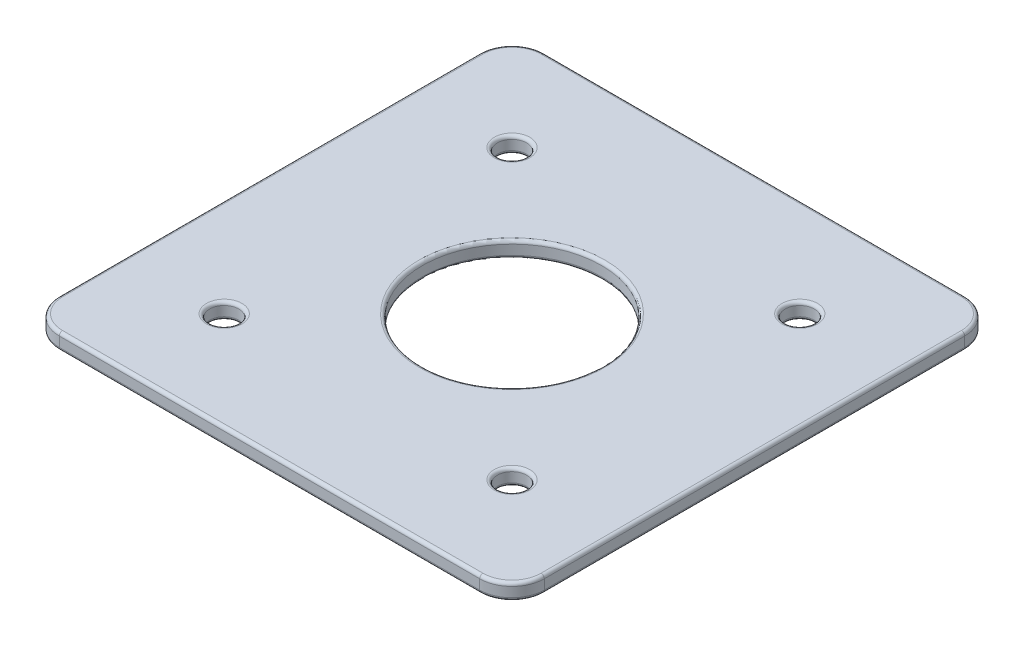
ISO-10303-21;
HEADER;
FILE_DESCRIPTION(('STEP AP214'),'2;1');
FILE_NAME('part.step','',(''),(''),'','','');
FILE_SCHEMA(('AUTOMOTIVE_DESIGN { 1 0 10303 214 1 1 1 1 }'));
ENDSEC;
DATA;
#1=APPLICATION_CONTEXT('core data for automotive mechanical design processes');
#2=APPLICATION_PROTOCOL_DEFINITION('international standard','automotive_design',2000,#1);
#3=PRODUCT_CONTEXT('',#1,'mechanical');
#4=PRODUCT('Part','Part','',(#3));
#5=PRODUCT_RELATED_PRODUCT_CATEGORY('part','',(#4));
#6=PRODUCT_DEFINITION_FORMATION('','',#4);
#7=PRODUCT_DEFINITION_CONTEXT('part definition',#1,'design');
#8=PRODUCT_DEFINITION('design','',#6,#7);
#9=PRODUCT_DEFINITION_SHAPE('','',#8);
#10=(LENGTH_UNIT() NAMED_UNIT(*) SI_UNIT(.MILLI.,.METRE.));
#11=(NAMED_UNIT(*) PLANE_ANGLE_UNIT() SI_UNIT($,.RADIAN.));
#12=(NAMED_UNIT(*) SI_UNIT($,.STERADIAN.) SOLID_ANGLE_UNIT());
#13=UNCERTAINTY_MEASURE_WITH_UNIT(LENGTH_MEASURE(1.E-05),#10,'distance_accuracy_value','');
#14=(GEOMETRIC_REPRESENTATION_CONTEXT(3) GLOBAL_UNCERTAINTY_ASSIGNED_CONTEXT((#13)) GLOBAL_UNIT_ASSIGNED_CONTEXT((#10,
#11,#12)) REPRESENTATION_CONTEXT('',''));
#15=CARTESIAN_POINT('',(0.,0.,0.));
#16=DIRECTION('',(0.,0.,1.));
#17=DIRECTION('',(1.,0.,0.));
#18=AXIS2_PLACEMENT_3D('',#15,#16,#17);
#19=CARTESIAN_POINT('',(75.,-5.,75.));
#20=DIRECTION('',(1.,0.,0.));
#21=DIRECTION('',(0.,0.,-1.));
#22=AXIS2_PLACEMENT_3D('',#19,#20,#21);
#23=PLANE('',#22);
#24=DIRECTION('',(0.,1.,0.));
#25=VECTOR('',#24,1.);
#26=CARTESIAN_POINT('',(75.,-5.,65.));
#27=LINE('',#26,#25);
#28=CARTESIAN_POINT('',(75.,-1.,65.));
#29=VERTEX_POINT('',#28);
#30=CARTESIAN_POINT('',(75.,-4.,65.));
#31=VERTEX_POINT('',#30);
#32=EDGE_CURVE('E340',#29,#31,#27,.F.);
#33=ORIENTED_EDGE('',*,*,#32,.T.);
#34=DIRECTION('',(0.,0.,-1.));
#35=VECTOR('',#34,1.);
#36=CARTESIAN_POINT('',(75.,-4.,75.));
#37=LINE('',#36,#35);
#38=CARTESIAN_POINT('',(75.,-4.,-65.));
#39=VERTEX_POINT('',#38);
#40=EDGE_CURVE('E199',#31,#39,#37,.T.);
#41=ORIENTED_EDGE('',*,*,#40,.T.);
#42=DIRECTION('',(0.,1.,0.));
#43=VECTOR('',#42,1.);
#44=CARTESIAN_POINT('',(75.,-5.,-65.));
#45=LINE('',#44,#43);
#46=CARTESIAN_POINT('',(75.,-1.,-65.));
#47=VERTEX_POINT('',#46);
#48=EDGE_CURVE('E348',#39,#47,#45,.T.);
#49=ORIENTED_EDGE('',*,*,#48,.T.);
#50=DIRECTION('',(0.,0.,-1.));
#51=VECTOR('',#50,1.);
#52=CARTESIAN_POINT('',(75.,-1.,65.));
#53=LINE('',#52,#51);
#54=EDGE_CURVE('E197',#47,#29,#53,.F.);
#55=ORIENTED_EDGE('',*,*,#54,.T.);
#56=EDGE_LOOP('',(#33,#41,#49,#55));
#57=FACE_BOUND('',#56,.T.);
#58=ADVANCED_FACE('F41',(#57),#23,.T.);
#59=CARTESIAN_POINT('',(-75.,-5.,75.));
#60=DIRECTION('',(0.,0.,1.));
#61=DIRECTION('',(1.,0.,0.));
#62=AXIS2_PLACEMENT_3D('',#59,#60,#61);
#63=PLANE('',#62);
#64=DIRECTION('',(0.,1.,0.));
#65=VECTOR('',#64,1.);
#66=CARTESIAN_POINT('',(-65.,-5.,75.));
#67=LINE('',#66,#65);
#68=CARTESIAN_POINT('',(-65.,-1.,75.));
#69=VERTEX_POINT('',#68);
#70=CARTESIAN_POINT('',(-65.,-4.,75.));
#71=VERTEX_POINT('',#70);
#72=EDGE_CURVE('E332',#69,#71,#67,.F.);
#73=ORIENTED_EDGE('',*,*,#72,.T.);
#74=DIRECTION('',(1.,0.,0.));
#75=VECTOR('',#74,1.);
#76=CARTESIAN_POINT('',(-75.,-4.,75.));
#77=LINE('',#76,#75);
#78=CARTESIAN_POINT('',(65.,-4.,75.));
#79=VERTEX_POINT('',#78);
#80=EDGE_CURVE('E191',#71,#79,#77,.T.);
#81=ORIENTED_EDGE('',*,*,#80,.T.);
#82=DIRECTION('',(0.,1.,0.));
#83=VECTOR('',#82,1.);
#84=CARTESIAN_POINT('',(65.,-5.,75.));
#85=LINE('',#84,#83);
#86=CARTESIAN_POINT('',(65.,-1.,75.));
#87=VERTEX_POINT('',#86);
#88=EDGE_CURVE('E352',#79,#87,#85,.T.);
#89=ORIENTED_EDGE('',*,*,#88,.T.);
#90=DIRECTION('',(1.,0.,0.));
#91=VECTOR('',#90,1.);
#92=CARTESIAN_POINT('',(-65.,-1.,75.));
#93=LINE('',#92,#91);
#94=EDGE_CURVE('E189',#87,#69,#93,.F.);
#95=ORIENTED_EDGE('',*,*,#94,.T.);
#96=EDGE_LOOP('',(#73,#81,#89,#95));
#97=FACE_BOUND('',#96,.T.);
#98=ADVANCED_FACE('F387',(#97),#63,.T.);
#99=CARTESIAN_POINT('',(-75.,-5.,75.));
#100=DIRECTION('',(-1.,0.,0.));
#101=DIRECTION('',(0.,0.,1.));
#102=AXIS2_PLACEMENT_3D('',#99,#100,#101);
#103=PLANE('',#102);
#104=DIRECTION('',(0.,1.,0.));
#105=VECTOR('',#104,1.);
#106=CARTESIAN_POINT('',(-75.,-5.,-65.));
#107=LINE('',#106,#105);
#108=CARTESIAN_POINT('',(-75.,-1.,-65.));
#109=VERTEX_POINT('',#108);
#110=CARTESIAN_POINT('',(-75.,-4.,-65.));
#111=VERTEX_POINT('',#110);
#112=EDGE_CURVE('E337',#109,#111,#107,.F.);
#113=ORIENTED_EDGE('',*,*,#112,.T.);
#114=DIRECTION('',(0.,0.,1.));
#115=VECTOR('',#114,1.);
#116=CARTESIAN_POINT('',(-75.,-4.,75.));
#117=LINE('',#116,#115);
#118=CARTESIAN_POINT('',(-75.,-4.,65.));
#119=VERTEX_POINT('',#118);
#120=EDGE_CURVE('E216',#111,#119,#117,.T.);
#121=ORIENTED_EDGE('',*,*,#120,.T.);
#122=DIRECTION('',(0.,1.,0.));
#123=VECTOR('',#122,1.);
#124=CARTESIAN_POINT('',(-75.,-5.,65.));
#125=LINE('',#124,#123);
#126=CARTESIAN_POINT('',(-75.,-1.,65.));
#127=VERTEX_POINT('',#126);
#128=EDGE_CURVE('E330',#119,#127,#125,.T.);
#129=ORIENTED_EDGE('',*,*,#128,.T.);
#130=DIRECTION('',(0.,0.,1.));
#131=VECTOR('',#130,1.);
#132=CARTESIAN_POINT('',(-75.,-1.,-65.));
#133=LINE('',#132,#131);
#134=EDGE_CURVE('E214',#127,#109,#133,.F.);
#135=ORIENTED_EDGE('',*,*,#134,.T.);
#136=EDGE_LOOP('',(#113,#121,#129,#135));
#137=FACE_BOUND('',#136,.T.);
#138=ADVANCED_FACE('F335',(#137),#103,.T.);
#139=CARTESIAN_POINT('',(-75.,-5.,-75.));
#140=DIRECTION('',(0.,0.,-1.));
#141=DIRECTION('',(-1.,0.,0.));
#142=AXIS2_PLACEMENT_3D('',#139,#140,#141);
#143=PLANE('',#142);
#144=DIRECTION('',(0.,1.,0.));
#145=VECTOR('',#144,1.);
#146=CARTESIAN_POINT('',(65.,-5.,-75.));
#147=LINE('',#146,#145);
#148=CARTESIAN_POINT('',(65.,-1.,-75.));
#149=VERTEX_POINT('',#148);
#150=CARTESIAN_POINT('',(65.,-4.,-75.));
#151=VERTEX_POINT('',#150);
#152=EDGE_CURVE('E292',#149,#151,#147,.F.);
#153=ORIENTED_EDGE('',*,*,#152,.T.);
#154=DIRECTION('',(-1.,0.,0.));
#155=VECTOR('',#154,1.);
#156=CARTESIAN_POINT('',(-75.,-4.,-75.));
#157=LINE('',#156,#155);
#158=CARTESIAN_POINT('',(-65.,-4.,-75.));
#159=VERTEX_POINT('',#158);
#160=EDGE_CURVE('E208',#151,#159,#157,.T.);
#161=ORIENTED_EDGE('',*,*,#160,.T.);
#162=DIRECTION('',(0.,1.,0.));
#163=VECTOR('',#162,1.);
#164=CARTESIAN_POINT('',(-65.,-5.,-75.));
#165=LINE('',#164,#163);
#166=CARTESIAN_POINT('',(-65.,-1.,-75.));
#167=VERTEX_POINT('',#166);
#168=EDGE_CURVE('E338',#159,#167,#165,.T.);
#169=ORIENTED_EDGE('',*,*,#168,.T.);
#170=DIRECTION('',(-1.,0.,0.));
#171=VECTOR('',#170,1.);
#172=CARTESIAN_POINT('',(65.,-1.,-75.));
#173=LINE('',#172,#171);
#174=EDGE_CURVE('E206',#167,#149,#173,.F.);
#175=ORIENTED_EDGE('',*,*,#174,.T.);
#176=EDGE_LOOP('',(#153,#161,#169,#175));
#177=FACE_BOUND('',#176,.T.);
#178=ADVANCED_FACE('F417',(#177),#143,.T.);
#179=CARTESIAN_POINT('',(0.,-5.,0.));
#180=DIRECTION('',(0.,-1.,0.));
#181=DIRECTION('',(0.,0.,-1.));
#182=AXIS2_PLACEMENT_3D('',#179,#180,#181);
#183=PLANE('',#182);
#184=DIRECTION('',(1.,0.,0.));
#185=VECTOR('',#184,1.);
#186=CARTESIAN_POINT('',(0.,-5.,74.));
#187=LINE('',#186,#185);
#188=CARTESIAN_POINT('',(65.,-5.,74.));
#189=VERTEX_POINT('',#188);
#190=CARTESIAN_POINT('',(-65.,-5.,74.));
#191=VERTEX_POINT('',#190);
#192=EDGE_CURVE('E179',#189,#191,#187,.F.);
#193=ORIENTED_EDGE('',*,*,#192,.T.);
#194=CARTESIAN_POINT('',(-65.,-5.,65.));
#195=DIRECTION('',(0.,-1.,0.));
#196=DIRECTION('',(0.,0.,-1.));
#197=AXIS2_PLACEMENT_3D('',#194,#195,#196);
#198=CIRCLE('',#197,9.);
#199=CARTESIAN_POINT('',(-74.,-5.,65.));
#200=VERTEX_POINT('',#199);
#201=EDGE_CURVE('E159',#191,#200,#198,.T.);
#202=ORIENTED_EDGE('',*,*,#201,.T.);
#203=DIRECTION('',(0.,0.,1.));
#204=VECTOR('',#203,1.);
#205=CARTESIAN_POINT('',(-74.,-5.,0.));
#206=LINE('',#205,#204);
#207=CARTESIAN_POINT('',(-74.,-5.,-65.));
#208=VERTEX_POINT('',#207);
#209=EDGE_CURVE('E167',#200,#208,#206,.F.);
#210=ORIENTED_EDGE('',*,*,#209,.T.);
#211=CARTESIAN_POINT('',(-65.,-5.,-65.));
#212=DIRECTION('',(0.,-1.,0.));
#213=DIRECTION('',(0.,0.,-1.));
#214=AXIS2_PLACEMENT_3D('',#211,#212,#213);
#215=CIRCLE('',#214,9.);
#216=CARTESIAN_POINT('',(-65.,-5.,-74.));
#217=VERTEX_POINT('',#216);
#218=EDGE_CURVE('E173',#208,#217,#215,.T.);
#219=ORIENTED_EDGE('',*,*,#218,.T.);
#220=DIRECTION('',(-1.,0.,0.));
#221=VECTOR('',#220,1.);
#222=CARTESIAN_POINT('',(0.,-5.,-74.));
#223=LINE('',#222,#221);
#224=CARTESIAN_POINT('',(65.,-5.,-74.));
#225=VERTEX_POINT('',#224);
#226=EDGE_CURVE('E370',#217,#225,#223,.F.);
#227=ORIENTED_EDGE('',*,*,#226,.T.);
#228=CARTESIAN_POINT('',(65.,-5.,-65.));
#229=DIRECTION('',(0.,-1.,0.));
#230=DIRECTION('',(0.,0.,-1.));
#231=AXIS2_PLACEMENT_3D('',#228,#229,#230);
#232=CIRCLE('',#231,9.);
#233=CARTESIAN_POINT('',(74.,-5.,-65.));
#234=VERTEX_POINT('',#233);
#235=EDGE_CURVE('E372',#225,#234,#232,.T.);
#236=ORIENTED_EDGE('',*,*,#235,.T.);
#237=DIRECTION('',(0.,0.,-1.));
#238=VECTOR('',#237,1.);
#239=CARTESIAN_POINT('',(74.,-5.,0.));
#240=LINE('',#239,#238);
#241=CARTESIAN_POINT('',(74.,-5.,65.));
#242=VERTEX_POINT('',#241);
#243=EDGE_CURVE('E374',#234,#242,#240,.F.);
#244=ORIENTED_EDGE('',*,*,#243,.T.);
#245=CARTESIAN_POINT('',(65.,-5.,65.));
#246=DIRECTION('',(0.,-1.,0.));
#247=DIRECTION('',(0.,0.,-1.));
#248=AXIS2_PLACEMENT_3D('',#245,#246,#247);
#249=CIRCLE('',#248,9.);
#250=EDGE_CURVE('E184',#242,#189,#249,.T.);
#251=ORIENTED_EDGE('',*,*,#250,.T.);
#252=EDGE_LOOP('',(#193,#202,#210,#219,#227,#236,#244,#251));
#253=FACE_BOUND('',#252,.T.);
#254=CARTESIAN_POINT('',(0.,-5.,0.));
#255=DIRECTION('',(0.,-1.,0.));
#256=DIRECTION('',(0.,0.,-1.));
#257=AXIS2_PLACEMENT_3D('',#254,#255,#256);
#258=CIRCLE('',#257,28.75);
#259=CARTESIAN_POINT('',(0.,-5.,-28.75));
#260=VERTEX_POINT('',#259);
#261=EDGE_CURVE('E174',#260,#260,#258,.F.);
#262=ORIENTED_EDGE('',*,*,#261,.T.);
#263=EDGE_LOOP('',(#262));
#264=FACE_BOUND('',#263,.T.);
#265=CARTESIAN_POINT('',(44.4982297400694,-5.,-44.4982297400694));
#266=DIRECTION('',(0.,-1.,0.));
#267=DIRECTION('',(0.,0.,-1.));
#268=AXIS2_PLACEMENT_3D('',#265,#266,#267);
#269=CIRCLE('',#268,5.5);
#270=CARTESIAN_POINT('',(44.4982297400694,-5.,-49.9982297400694));
#271=VERTEX_POINT('',#270);
#272=EDGE_CURVE('E364',#271,#271,#269,.F.);
#273=ORIENTED_EDGE('',*,*,#272,.T.);
#274=EDGE_LOOP('',(#273));
#275=FACE_BOUND('',#274,.T.);
#276=CARTESIAN_POINT('',(-44.4982297400694,-5.,44.4982297400695));
#277=DIRECTION('',(0.,-1.,0.));
#278=DIRECTION('',(0.,0.,-1.));
#279=AXIS2_PLACEMENT_3D('',#276,#277,#278);
#280=CIRCLE('',#279,5.50000000000001);
#281=CARTESIAN_POINT('',(-44.4982297400694,-5.,38.9982297400695));
#282=VERTEX_POINT('',#281);
#283=EDGE_CURVE('E361',#282,#282,#280,.F.);
#284=ORIENTED_EDGE('',*,*,#283,.T.);
#285=EDGE_LOOP('',(#284));
#286=FACE_BOUND('',#285,.T.);
#287=CARTESIAN_POINT('',(44.4982297400694,-5.,44.4982297400695));
#288=DIRECTION('',(0.,-1.,0.));
#289=DIRECTION('',(0.,0.,-1.));
#290=AXIS2_PLACEMENT_3D('',#287,#288,#289);
#291=CIRCLE('',#290,5.5);
#292=CARTESIAN_POINT('',(44.4982297400694,-5.,38.9982297400695));
#293=VERTEX_POINT('',#292);
#294=EDGE_CURVE('E358',#293,#293,#291,.F.);
#295=ORIENTED_EDGE('',*,*,#294,.T.);
#296=EDGE_LOOP('',(#295));
#297=FACE_BOUND('',#296,.T.);
#298=CARTESIAN_POINT('',(-44.4982297400694,-5.,-44.4982297400694));
#299=DIRECTION('',(0.,-1.,0.));
#300=DIRECTION('',(0.,0.,-1.));
#301=AXIS2_PLACEMENT_3D('',#298,#299,#300);
#302=CIRCLE('',#301,5.5);
#303=CARTESIAN_POINT('',(-44.4982297400694,-5.,-49.9982297400694));
#304=VERTEX_POINT('',#303);
#305=EDGE_CURVE('E355',#304,#304,#302,.F.);
#306=ORIENTED_EDGE('',*,*,#305,.T.);
#307=EDGE_LOOP('',(#306));
#308=FACE_BOUND('',#307,.T.);
#309=ADVANCED_FACE('F176',(#253,#264,#275,#286,#297,#308),#183,.T.);
#310=CARTESIAN_POINT('',(0.,0.,0.));
#311=DIRECTION('',(0.,-1.,0.));
#312=DIRECTION('',(0.,0.,-1.));
#313=AXIS2_PLACEMENT_3D('',#310,#311,#312);
#314=PLANE('',#313);
#315=DIRECTION('',(0.,0.,-1.));
#316=VECTOR('',#315,1.);
#317=CARTESIAN_POINT('',(74.,0.,-65.));
#318=LINE('',#317,#316);
#319=CARTESIAN_POINT('',(74.,0.,65.));
#320=VERTEX_POINT('',#319);
#321=CARTESIAN_POINT('',(74.,0.,-65.));
#322=VERTEX_POINT('',#321);
#323=EDGE_CURVE('E50',#320,#322,#318,.T.);
#324=ORIENTED_EDGE('',*,*,#323,.T.);
#325=CARTESIAN_POINT('',(65.,0.,-65.));
#326=DIRECTION('',(0.,-1.,0.));
#327=DIRECTION('',(0.,0.,-1.));
#328=AXIS2_PLACEMENT_3D('',#325,#326,#327);
#329=CIRCLE('',#328,9.);
#330=CARTESIAN_POINT('',(65.,0.,-74.));
#331=VERTEX_POINT('',#330);
#332=EDGE_CURVE('E11',#322,#331,#329,.F.);
#333=ORIENTED_EDGE('',*,*,#332,.T.);
#334=DIRECTION('',(-1.,0.,0.));
#335=VECTOR('',#334,1.);
#336=CARTESIAN_POINT('',(-65.,0.,-74.));
#337=LINE('',#336,#335);
#338=CARTESIAN_POINT('',(-65.,0.,-74.));
#339=VERTEX_POINT('',#338);
#340=EDGE_CURVE('E263',#331,#339,#337,.T.);
#341=ORIENTED_EDGE('',*,*,#340,.T.);
#342=CARTESIAN_POINT('',(-65.,0.,-65.));
#343=DIRECTION('',(0.,-1.,0.));
#344=DIRECTION('',(0.,0.,-1.));
#345=AXIS2_PLACEMENT_3D('',#342,#343,#344);
#346=CIRCLE('',#345,9.);
#347=CARTESIAN_POINT('',(-74.,0.,-65.));
#348=VERTEX_POINT('',#347);
#349=EDGE_CURVE('E265',#339,#348,#346,.F.);
#350=ORIENTED_EDGE('',*,*,#349,.T.);
#351=DIRECTION('',(0.,0.,1.));
#352=VECTOR('',#351,1.);
#353=CARTESIAN_POINT('',(-74.,0.,65.));
#354=LINE('',#353,#352);
#355=CARTESIAN_POINT('',(-74.,0.,65.));
#356=VERTEX_POINT('',#355);
#357=EDGE_CURVE('E267',#348,#356,#354,.T.);
#358=ORIENTED_EDGE('',*,*,#357,.T.);
#359=CARTESIAN_POINT('',(-65.,0.,65.));
#360=DIRECTION('',(0.,-1.,0.));
#361=DIRECTION('',(0.,0.,-1.));
#362=AXIS2_PLACEMENT_3D('',#359,#360,#361);
#363=CIRCLE('',#362,9.);
#364=CARTESIAN_POINT('',(-65.,0.,74.));
#365=VERTEX_POINT('',#364);
#366=EDGE_CURVE('E269',#356,#365,#363,.F.);
#367=ORIENTED_EDGE('',*,*,#366,.T.);
#368=DIRECTION('',(1.,0.,0.));
#369=VECTOR('',#368,1.);
#370=CARTESIAN_POINT('',(65.,0.,74.));
#371=LINE('',#370,#369);
#372=CARTESIAN_POINT('',(65.,0.,74.));
#373=VERTEX_POINT('',#372);
#374=EDGE_CURVE('E271',#365,#373,#371,.T.);
#375=ORIENTED_EDGE('',*,*,#374,.T.);
#376=CARTESIAN_POINT('',(65.,0.,65.));
#377=DIRECTION('',(0.,-1.,0.));
#378=DIRECTION('',(0.,0.,-1.));
#379=AXIS2_PLACEMENT_3D('',#376,#377,#378);
#380=CIRCLE('',#379,9.);
#381=EDGE_CURVE('E61',#373,#320,#380,.F.);
#382=ORIENTED_EDGE('',*,*,#381,.T.);
#383=EDGE_LOOP('',(#324,#333,#341,#350,#358,#367,#375,#382));
#384=FACE_BOUND('',#383,.T.);
#385=CARTESIAN_POINT('',(0.,0.,0.));
#386=DIRECTION('',(0.,-1.,0.));
#387=DIRECTION('',(0.,0.,-1.));
#388=AXIS2_PLACEMENT_3D('',#385,#386,#387);
#389=CIRCLE('',#388,28.75);
#390=CARTESIAN_POINT('',(0.,0.,-28.75));
#391=VERTEX_POINT('',#390);
#392=EDGE_CURVE('E260',#391,#391,#389,.T.);
#393=ORIENTED_EDGE('',*,*,#392,.T.);
#394=EDGE_LOOP('',(#393));
#395=FACE_BOUND('',#394,.T.);
#396=CARTESIAN_POINT('',(44.4982297400694,0.,-44.4982297400694));
#397=DIRECTION('',(0.,-1.,0.));
#398=DIRECTION('',(0.,0.,-1.));
#399=AXIS2_PLACEMENT_3D('',#396,#397,#398);
#400=CIRCLE('',#399,5.5);
#401=CARTESIAN_POINT('',(44.4982297400694,0.,-49.9982297400694));
#402=VERTEX_POINT('',#401);
#403=EDGE_CURVE('E257',#402,#402,#400,.T.);
#404=ORIENTED_EDGE('',*,*,#403,.T.);
#405=EDGE_LOOP('',(#404));
#406=FACE_BOUND('',#405,.T.);
#407=CARTESIAN_POINT('',(-44.4982297400694,0.,44.4982297400695));
#408=DIRECTION('',(0.,-1.,0.));
#409=DIRECTION('',(0.,0.,-1.));
#410=AXIS2_PLACEMENT_3D('',#407,#408,#409);
#411=CIRCLE('',#410,5.50000000000001);
#412=CARTESIAN_POINT('',(-44.4982297400694,0.,38.9982297400695));
#413=VERTEX_POINT('',#412);
#414=EDGE_CURVE('E254',#413,#413,#411,.T.);
#415=ORIENTED_EDGE('',*,*,#414,.T.);
#416=EDGE_LOOP('',(#415));
#417=FACE_BOUND('',#416,.T.);
#418=CARTESIAN_POINT('',(44.4982297400694,0.,44.4982297400695));
#419=DIRECTION('',(0.,-1.,0.));
#420=DIRECTION('',(0.,0.,-1.));
#421=AXIS2_PLACEMENT_3D('',#418,#419,#420);
#422=CIRCLE('',#421,5.5);
#423=CARTESIAN_POINT('',(44.4982297400694,0.,38.9982297400695));
#424=VERTEX_POINT('',#423);
#425=EDGE_CURVE('E251',#424,#424,#422,.T.);
#426=ORIENTED_EDGE('',*,*,#425,.T.);
#427=EDGE_LOOP('',(#426));
#428=FACE_BOUND('',#427,.T.);
#429=CARTESIAN_POINT('',(-44.4982297400694,0.,-44.4982297400694));
#430=DIRECTION('',(0.,-1.,0.));
#431=DIRECTION('',(0.,0.,-1.));
#432=AXIS2_PLACEMENT_3D('',#429,#430,#431);
#433=CIRCLE('',#432,5.5);
#434=CARTESIAN_POINT('',(-44.4982297400694,0.,-49.9982297400694));
#435=VERTEX_POINT('',#434);
#436=EDGE_CURVE('E248',#435,#435,#433,.T.);
#437=ORIENTED_EDGE('',*,*,#436,.T.);
#438=EDGE_LOOP('',(#437));
#439=FACE_BOUND('',#438,.T.);
#440=ADVANCED_FACE('F403',(#384,#395,#406,#417,#428,#439),#314,.F.);
#441=CARTESIAN_POINT('',(0.,-5.,0.));
#442=DIRECTION('',(0.,1.,0.));
#443=DIRECTION('',(0.,0.,1.));
#444=AXIS2_PLACEMENT_3D('',#441,#442,#443);
#445=CYLINDRICAL_SURFACE('',#444,27.75);
#446=CARTESIAN_POINT('',(0.,-4.,0.));
#447=DIRECTION('',(0.,-1.,0.));
#448=DIRECTION('',(0.,0.,-1.));
#449=AXIS2_PLACEMENT_3D('',#446,#447,#448);
#450=CIRCLE('',#449,27.75);
#451=CARTESIAN_POINT('',(0.,-4.,-27.75));
#452=VERTEX_POINT('',#451);
#453=EDGE_CURVE('E221',#452,#452,#450,.T.);
#454=ORIENTED_EDGE('',*,*,#453,.T.);
#455=EDGE_LOOP('',(#454));
#456=FACE_BOUND('',#455,.T.);
#457=CARTESIAN_POINT('',(0.,-1.,0.));
#458=DIRECTION('',(0.,-1.,0.));
#459=DIRECTION('',(0.,0.,-1.));
#460=AXIS2_PLACEMENT_3D('',#457,#458,#459);
#461=CIRCLE('',#460,27.75);
#462=CARTESIAN_POINT('',(0.,-1.,-27.75));
#463=VERTEX_POINT('',#462);
#464=EDGE_CURVE('E218',#463,#463,#461,.F.);
#465=ORIENTED_EDGE('',*,*,#464,.T.);
#466=EDGE_LOOP('',(#465));
#467=FACE_BOUND('',#466,.T.);
#468=ADVANCED_FACE('F549',(#456,#467),#445,.F.);
#469=CARTESIAN_POINT('',(44.4982297400694,-5.,-44.4982297400694));
#470=DIRECTION('',(0.,1.,0.));
#471=DIRECTION('',(0.,0.,1.));
#472=AXIS2_PLACEMENT_3D('',#469,#470,#471);
#473=CYLINDRICAL_SURFACE('',#472,4.5);
#474=CARTESIAN_POINT('',(44.4982297400694,-4.,-44.4982297400694));
#475=DIRECTION('',(0.,-1.,0.));
#476=DIRECTION('',(0.,0.,-1.));
#477=AXIS2_PLACEMENT_3D('',#474,#475,#476);
#478=CIRCLE('',#477,4.5);
#479=CARTESIAN_POINT('',(44.4982297400694,-4.,-48.9982297400694));
#480=VERTEX_POINT('',#479);
#481=EDGE_CURVE('E227',#480,#480,#478,.T.);
#482=ORIENTED_EDGE('',*,*,#481,.T.);
#483=EDGE_LOOP('',(#482));
#484=FACE_BOUND('',#483,.T.);
#485=CARTESIAN_POINT('',(44.4982297400694,-1.,-44.4982297400694));
#486=DIRECTION('',(0.,-1.,0.));
#487=DIRECTION('',(0.,0.,-1.));
#488=AXIS2_PLACEMENT_3D('',#485,#486,#487);
#489=CIRCLE('',#488,4.5);
#490=CARTESIAN_POINT('',(44.4982297400694,-1.,-48.9982297400694));
#491=VERTEX_POINT('',#490);
#492=EDGE_CURVE('E224',#491,#491,#489,.F.);
#493=ORIENTED_EDGE('',*,*,#492,.T.);
#494=EDGE_LOOP('',(#493));
#495=FACE_BOUND('',#494,.T.);
#496=ADVANCED_FACE('F543',(#484,#495),#473,.F.);
#497=CARTESIAN_POINT('',(-44.4982297400694,-5.,44.4982297400695));
#498=DIRECTION('',(0.,1.,0.));
#499=DIRECTION('',(0.,0.,1.));
#500=AXIS2_PLACEMENT_3D('',#497,#498,#499);
#501=CYLINDRICAL_SURFACE('',#500,4.50000000000001);
#502=CARTESIAN_POINT('',(-44.4982297400694,-4.,44.4982297400695));
#503=DIRECTION('',(0.,-1.,0.));
#504=DIRECTION('',(0.,0.,-1.));
#505=AXIS2_PLACEMENT_3D('',#502,#503,#504);
#506=CIRCLE('',#505,4.50000000000001);
#507=CARTESIAN_POINT('',(-44.4982297400694,-4.,39.9982297400695));
#508=VERTEX_POINT('',#507);
#509=EDGE_CURVE('E233',#508,#508,#506,.T.);
#510=ORIENTED_EDGE('',*,*,#509,.T.);
#511=EDGE_LOOP('',(#510));
#512=FACE_BOUND('',#511,.T.);
#513=CARTESIAN_POINT('',(-44.4982297400694,-1.,44.4982297400695));
#514=DIRECTION('',(0.,-1.,0.));
#515=DIRECTION('',(0.,0.,-1.));
#516=AXIS2_PLACEMENT_3D('',#513,#514,#515);
#517=CIRCLE('',#516,4.50000000000001);
#518=CARTESIAN_POINT('',(-44.4982297400694,-1.,39.9982297400695));
#519=VERTEX_POINT('',#518);
#520=EDGE_CURVE('E230',#519,#519,#517,.F.);
#521=ORIENTED_EDGE('',*,*,#520,.T.);
#522=EDGE_LOOP('',(#521));
#523=FACE_BOUND('',#522,.T.);
#524=ADVANCED_FACE('F534',(#512,#523),#501,.F.);
#525=CARTESIAN_POINT('',(44.4982297400694,-5.,44.4982297400695));
#526=DIRECTION('',(0.,1.,0.));
#527=DIRECTION('',(0.,0.,1.));
#528=AXIS2_PLACEMENT_3D('',#525,#526,#527);
#529=CYLINDRICAL_SURFACE('',#528,4.5);
#530=CARTESIAN_POINT('',(44.4982297400694,-4.,44.4982297400695));
#531=DIRECTION('',(0.,-1.,0.));
#532=DIRECTION('',(0.,0.,-1.));
#533=AXIS2_PLACEMENT_3D('',#530,#531,#532);
#534=CIRCLE('',#533,4.5);
#535=CARTESIAN_POINT('',(44.4982297400694,-4.,39.9982297400695));
#536=VERTEX_POINT('',#535);
#537=EDGE_CURVE('E239',#536,#536,#534,.T.);
#538=ORIENTED_EDGE('',*,*,#537,.T.);
#539=EDGE_LOOP('',(#538));
#540=FACE_BOUND('',#539,.T.);
#541=CARTESIAN_POINT('',(44.4982297400694,-1.,44.4982297400695));
#542=DIRECTION('',(0.,-1.,0.));
#543=DIRECTION('',(0.,0.,-1.));
#544=AXIS2_PLACEMENT_3D('',#541,#542,#543);
#545=CIRCLE('',#544,4.5);
#546=CARTESIAN_POINT('',(44.4982297400694,-1.,39.9982297400695));
#547=VERTEX_POINT('',#546);
#548=EDGE_CURVE('E236',#547,#547,#545,.F.);
#549=ORIENTED_EDGE('',*,*,#548,.T.);
#550=EDGE_LOOP('',(#549));
#551=FACE_BOUND('',#550,.T.);
#552=ADVANCED_FACE('F532',(#540,#551),#529,.F.);
#553=CARTESIAN_POINT('',(-44.4982297400694,-5.,-44.4982297400694));
#554=DIRECTION('',(0.,1.,0.));
#555=DIRECTION('',(0.,0.,1.));
#556=AXIS2_PLACEMENT_3D('',#553,#554,#555);
#557=CYLINDRICAL_SURFACE('',#556,4.5);
#558=CARTESIAN_POINT('',(-44.4982297400694,-4.,-44.4982297400694));
#559=DIRECTION('',(0.,-1.,0.));
#560=DIRECTION('',(0.,0.,-1.));
#561=AXIS2_PLACEMENT_3D('',#558,#559,#560);
#562=CIRCLE('',#561,4.5);
#563=CARTESIAN_POINT('',(-44.4982297400694,-4.,-48.9982297400694));
#564=VERTEX_POINT('',#563);
#565=EDGE_CURVE('E245',#564,#564,#562,.T.);
#566=ORIENTED_EDGE('',*,*,#565,.T.);
#567=EDGE_LOOP('',(#566));
#568=FACE_BOUND('',#567,.T.);
#569=CARTESIAN_POINT('',(-44.4982297400694,-1.,-44.4982297400694));
#570=DIRECTION('',(0.,-1.,0.));
#571=DIRECTION('',(0.,0.,-1.));
#572=AXIS2_PLACEMENT_3D('',#569,#570,#571);
#573=CIRCLE('',#572,4.5);
#574=CARTESIAN_POINT('',(-44.4982297400694,-1.,-48.9982297400694));
#575=VERTEX_POINT('',#574);
#576=EDGE_CURVE('E242',#575,#575,#573,.F.);
#577=ORIENTED_EDGE('',*,*,#576,.T.);
#578=EDGE_LOOP('',(#577));
#579=FACE_BOUND('',#578,.T.);
#580=ADVANCED_FACE('F445',(#568,#579),#557,.F.);
#581=CARTESIAN_POINT('',(-65.,-5.,-65.));
#582=DIRECTION('',(0.,1.,0.));
#583=DIRECTION('',(0.,0.,1.));
#584=AXIS2_PLACEMENT_3D('',#581,#582,#583);
#585=CYLINDRICAL_SURFACE('',#584,10.);
#586=ORIENTED_EDGE('',*,*,#168,.F.);
#587=CARTESIAN_POINT('',(-65.,-4.,-65.));
#588=DIRECTION('',(0.,-1.,0.));
#589=DIRECTION('',(0.,0.,-1.));
#590=AXIS2_PLACEMENT_3D('',#587,#588,#589);
#591=CIRCLE('',#590,10.);
#592=EDGE_CURVE('E212',#159,#111,#591,.F.);
#593=ORIENTED_EDGE('',*,*,#592,.T.);
#594=ORIENTED_EDGE('',*,*,#112,.F.);
#595=CARTESIAN_POINT('',(-65.,-1.,-65.));
#596=DIRECTION('',(0.,-1.,0.));
#597=DIRECTION('',(0.,0.,-1.));
#598=AXIS2_PLACEMENT_3D('',#595,#596,#597);
#599=CIRCLE('',#598,10.);
#600=EDGE_CURVE('E210',#109,#167,#599,.T.);
#601=ORIENTED_EDGE('',*,*,#600,.T.);
#602=EDGE_LOOP('',(#586,#593,#594,#601));
#603=FACE_BOUND('',#602,.T.);
#604=ADVANCED_FACE('F442',(#603),#585,.T.);
#605=CARTESIAN_POINT('',(65.,-5.,-65.));
#606=DIRECTION('',(0.,1.,0.));
#607=DIRECTION('',(0.,0.,1.));
#608=AXIS2_PLACEMENT_3D('',#605,#606,#607);
#609=CYLINDRICAL_SURFACE('',#608,10.);
#610=ORIENTED_EDGE('',*,*,#48,.F.);
#611=CARTESIAN_POINT('',(65.,-4.,-65.));
#612=DIRECTION('',(0.,-1.,0.));
#613=DIRECTION('',(0.,0.,-1.));
#614=AXIS2_PLACEMENT_3D('',#611,#612,#613);
#615=CIRCLE('',#614,10.);
#616=EDGE_CURVE('E204',#39,#151,#615,.F.);
#617=ORIENTED_EDGE('',*,*,#616,.T.);
#618=ORIENTED_EDGE('',*,*,#152,.F.);
#619=CARTESIAN_POINT('',(65.,-1.,-65.));
#620=DIRECTION('',(0.,-1.,0.));
#621=DIRECTION('',(0.,0.,-1.));
#622=AXIS2_PLACEMENT_3D('',#619,#620,#621);
#623=CIRCLE('',#622,10.);
#624=EDGE_CURVE('E201',#149,#47,#623,.T.);
#625=ORIENTED_EDGE('',*,*,#624,.T.);
#626=EDGE_LOOP('',(#610,#617,#618,#625));
#627=FACE_BOUND('',#626,.T.);
#628=ADVANCED_FACE('F422',(#627),#609,.T.);
#629=CARTESIAN_POINT('',(65.,-5.,65.));
#630=DIRECTION('',(0.,1.,0.));
#631=DIRECTION('',(0.,0.,1.));
#632=AXIS2_PLACEMENT_3D('',#629,#630,#631);
#633=CYLINDRICAL_SURFACE('',#632,10.);
#634=ORIENTED_EDGE('',*,*,#88,.F.);
#635=CARTESIAN_POINT('',(65.,-4.,65.));
#636=DIRECTION('',(0.,-1.,0.));
#637=DIRECTION('',(0.,0.,-1.));
#638=AXIS2_PLACEMENT_3D('',#635,#636,#637);
#639=CIRCLE('',#638,10.);
#640=EDGE_CURVE('E195',#79,#31,#639,.F.);
#641=ORIENTED_EDGE('',*,*,#640,.T.);
#642=ORIENTED_EDGE('',*,*,#32,.F.);
#643=CARTESIAN_POINT('',(65.,-1.,65.));
#644=DIRECTION('',(0.,-1.,0.));
#645=DIRECTION('',(0.,0.,-1.));
#646=AXIS2_PLACEMENT_3D('',#643,#644,#645);
#647=CIRCLE('',#646,10.);
#648=EDGE_CURVE('E193',#29,#87,#647,.T.);
#649=ORIENTED_EDGE('',*,*,#648,.T.);
#650=EDGE_LOOP('',(#634,#641,#642,#649));
#651=FACE_BOUND('',#650,.T.);
#652=ADVANCED_FACE('F389',(#651),#633,.T.);
#653=CARTESIAN_POINT('',(-65.,-5.,65.));
#654=DIRECTION('',(0.,1.,0.));
#655=DIRECTION('',(0.,0.,1.));
#656=AXIS2_PLACEMENT_3D('',#653,#654,#655);
#657=CYLINDRICAL_SURFACE('',#656,10.);
#658=ORIENTED_EDGE('',*,*,#128,.F.);
#659=CARTESIAN_POINT('',(-65.,-4.,65.));
#660=DIRECTION('',(0.,-1.,0.));
#661=DIRECTION('',(0.,0.,-1.));
#662=AXIS2_PLACEMENT_3D('',#659,#660,#661);
#663=CIRCLE('',#662,10.);
#664=EDGE_CURVE('E161',#119,#71,#663,.F.);
#665=ORIENTED_EDGE('',*,*,#664,.T.);
#666=ORIENTED_EDGE('',*,*,#72,.F.);
#667=CARTESIAN_POINT('',(-65.,-1.,65.));
#668=DIRECTION('',(0.,-1.,0.));
#669=DIRECTION('',(0.,0.,-1.));
#670=AXIS2_PLACEMENT_3D('',#667,#668,#669);
#671=CIRCLE('',#670,10.);
#672=EDGE_CURVE('E181',#69,#127,#671,.T.);
#673=ORIENTED_EDGE('',*,*,#672,.T.);
#674=EDGE_LOOP('',(#658,#665,#666,#673));
#675=FACE_BOUND('',#674,.T.);
#676=ADVANCED_FACE('F329',(#675),#657,.T.);
#677=CARTESIAN_POINT('',(65.,-4.,-65.));
#678=DIRECTION('',(0.,-1.,0.));
#679=DIRECTION('',(0.,0.,-1.));
#680=AXIS2_PLACEMENT_3D('',#677,#678,#679);
#681=TOROIDAL_SURFACE('',#680,9.,1.);
#682=CARTESIAN_POINT('',(65.,-4.,-74.));
#683=DIRECTION('',(-1.,0.,0.));
#684=DIRECTION('',(0.,0.,1.));
#685=AXIS2_PLACEMENT_3D('',#682,#683,#684);
#686=CIRCLE('',#685,1.);
#687=EDGE_CURVE('E286',#151,#225,#686,.T.);
#688=ORIENTED_EDGE('',*,*,#687,.F.);
#689=ORIENTED_EDGE('',*,*,#616,.F.);
#690=CARTESIAN_POINT('',(74.,-4.,-65.));
#691=DIRECTION('',(0.,0.,1.));
#692=DIRECTION('',(1.,0.,0.));
#693=AXIS2_PLACEMENT_3D('',#690,#691,#692);
#694=CIRCLE('',#693,1.);
#695=EDGE_CURVE('E289',#234,#39,#694,.T.);
#696=ORIENTED_EDGE('',*,*,#695,.F.);
#697=ORIENTED_EDGE('',*,*,#235,.F.);
#698=EDGE_LOOP('',(#688,#689,#696,#697));
#699=FACE_BOUND('',#698,.T.);
#700=ADVANCED_FACE('F426',(#699),#681,.T.);
#701=CARTESIAN_POINT('',(74.,-4.,75.));
#702=DIRECTION('',(0.,0.,-1.));
#703=DIRECTION('',(-1.,0.,0.));
#704=AXIS2_PLACEMENT_3D('',#701,#702,#703);
#705=CYLINDRICAL_SURFACE('',#704,1.);
#706=ORIENTED_EDGE('',*,*,#695,.T.);
#707=ORIENTED_EDGE('',*,*,#40,.F.);
#708=CARTESIAN_POINT('',(74.,-4.,65.));
#709=DIRECTION('',(0.,0.,1.));
#710=DIRECTION('',(1.,0.,0.));
#711=AXIS2_PLACEMENT_3D('',#708,#709,#710);
#712=CIRCLE('',#711,1.);
#713=EDGE_CURVE('E283',#242,#31,#712,.T.);
#714=ORIENTED_EDGE('',*,*,#713,.F.);
#715=ORIENTED_EDGE('',*,*,#243,.F.);
#716=EDGE_LOOP('',(#706,#707,#714,#715));
#717=FACE_BOUND('',#716,.T.);
#718=ADVANCED_FACE('F431',(#717),#705,.T.);
#719=CARTESIAN_POINT('',(-75.,-4.,-74.));
#720=DIRECTION('',(-1.,0.,0.));
#721=DIRECTION('',(0.,0.,1.));
#722=AXIS2_PLACEMENT_3D('',#719,#720,#721);
#723=CYLINDRICAL_SURFACE('',#722,1.);
#724=ORIENTED_EDGE('',*,*,#687,.T.);
#725=ORIENTED_EDGE('',*,*,#226,.F.);
#726=CARTESIAN_POINT('',(-65.,-4.,-74.));
#727=DIRECTION('',(-1.,0.,0.));
#728=DIRECTION('',(0.,0.,1.));
#729=AXIS2_PLACEMENT_3D('',#726,#727,#728);
#730=CIRCLE('',#729,1.);
#731=EDGE_CURVE('E280',#159,#217,#730,.T.);
#732=ORIENTED_EDGE('',*,*,#731,.F.);
#733=ORIENTED_EDGE('',*,*,#160,.F.);
#734=EDGE_LOOP('',(#724,#725,#732,#733));
#735=FACE_BOUND('',#734,.T.);
#736=ADVANCED_FACE('F466',(#735),#723,.T.);
#737=CARTESIAN_POINT('',(65.,-4.,65.));
#738=DIRECTION('',(0.,-1.,0.));
#739=DIRECTION('',(0.,0.,-1.));
#740=AXIS2_PLACEMENT_3D('',#737,#738,#739);
#741=TOROIDAL_SURFACE('',#740,9.,1.);
#742=ORIENTED_EDGE('',*,*,#713,.T.);
#743=ORIENTED_EDGE('',*,*,#640,.F.);
#744=CARTESIAN_POINT('',(65.,-4.,74.));
#745=DIRECTION('',(-1.,0.,0.));
#746=DIRECTION('',(0.,0.,1.));
#747=AXIS2_PLACEMENT_3D('',#744,#745,#746);
#748=CIRCLE('',#747,1.);
#749=EDGE_CURVE('E277',#189,#79,#748,.T.);
#750=ORIENTED_EDGE('',*,*,#749,.F.);
#751=ORIENTED_EDGE('',*,*,#250,.F.);
#752=EDGE_LOOP('',(#742,#743,#750,#751));
#753=FACE_BOUND('',#752,.T.);
#754=ADVANCED_FACE('F381',(#753),#741,.T.);
#755=CARTESIAN_POINT('',(-65.,-4.,-65.));
#756=DIRECTION('',(0.,-1.,0.));
#757=DIRECTION('',(0.,0.,-1.));
#758=AXIS2_PLACEMENT_3D('',#755,#756,#757);
#759=TOROIDAL_SURFACE('',#758,9.,1.);
#760=ORIENTED_EDGE('',*,*,#731,.T.);
#761=ORIENTED_EDGE('',*,*,#218,.F.);
#762=CARTESIAN_POINT('',(-74.,-4.,-65.));
#763=DIRECTION('',(0.,0.,1.));
#764=DIRECTION('',(1.,0.,0.));
#765=AXIS2_PLACEMENT_3D('',#762,#763,#764);
#766=CIRCLE('',#765,1.);
#767=EDGE_CURVE('E170',#111,#208,#766,.T.);
#768=ORIENTED_EDGE('',*,*,#767,.F.);
#769=ORIENTED_EDGE('',*,*,#592,.F.);
#770=EDGE_LOOP('',(#760,#761,#768,#769));
#771=FACE_BOUND('',#770,.T.);
#772=ADVANCED_FACE('F460',(#771),#759,.T.);
#773=CARTESIAN_POINT('',(-75.,-4.,74.));
#774=DIRECTION('',(1.,0.,0.));
#775=DIRECTION('',(0.,0.,-1.));
#776=AXIS2_PLACEMENT_3D('',#773,#774,#775);
#777=CYLINDRICAL_SURFACE('',#776,1.);
#778=ORIENTED_EDGE('',*,*,#749,.T.);
#779=ORIENTED_EDGE('',*,*,#80,.F.);
#780=CARTESIAN_POINT('',(-65.,-4.,74.));
#781=DIRECTION('',(-1.,0.,0.));
#782=DIRECTION('',(0.,0.,1.));
#783=AXIS2_PLACEMENT_3D('',#780,#781,#782);
#784=CIRCLE('',#783,1.);
#785=EDGE_CURVE('E164',#191,#71,#784,.T.);
#786=ORIENTED_EDGE('',*,*,#785,.F.);
#787=ORIENTED_EDGE('',*,*,#192,.F.);
#788=EDGE_LOOP('',(#778,#779,#786,#787));
#789=FACE_BOUND('',#788,.T.);
#790=ADVANCED_FACE('F384',(#789),#777,.T.);
#791=CARTESIAN_POINT('',(-74.,-4.,75.));
#792=DIRECTION('',(0.,0.,1.));
#793=DIRECTION('',(1.,0.,0.));
#794=AXIS2_PLACEMENT_3D('',#791,#792,#793);
#795=CYLINDRICAL_SURFACE('',#794,1.);
#796=ORIENTED_EDGE('',*,*,#767,.T.);
#797=ORIENTED_EDGE('',*,*,#209,.F.);
#798=CARTESIAN_POINT('',(-74.,-4.,65.));
#799=DIRECTION('',(0.,0.,1.));
#800=DIRECTION('',(1.,0.,0.));
#801=AXIS2_PLACEMENT_3D('',#798,#799,#800);
#802=CIRCLE('',#801,1.);
#803=EDGE_CURVE('E155',#119,#200,#802,.T.);
#804=ORIENTED_EDGE('',*,*,#803,.F.);
#805=ORIENTED_EDGE('',*,*,#120,.F.);
#806=EDGE_LOOP('',(#796,#797,#804,#805));
#807=FACE_BOUND('',#806,.T.);
#808=ADVANCED_FACE('F168',(#807),#795,.T.);
#809=CARTESIAN_POINT('',(-65.,-4.,65.));
#810=DIRECTION('',(0.,-1.,0.));
#811=DIRECTION('',(0.,0.,-1.));
#812=AXIS2_PLACEMENT_3D('',#809,#810,#811);
#813=TOROIDAL_SURFACE('',#812,9.,1.);
#814=ORIENTED_EDGE('',*,*,#785,.T.);
#815=ORIENTED_EDGE('',*,*,#664,.F.);
#816=ORIENTED_EDGE('',*,*,#803,.T.);
#817=ORIENTED_EDGE('',*,*,#201,.F.);
#818=EDGE_LOOP('',(#814,#815,#816,#817));
#819=FACE_BOUND('',#818,.T.);
#820=ADVANCED_FACE('F157',(#819),#813,.T.);
#821=CARTESIAN_POINT('',(0.,-4.,0.));
#822=DIRECTION('',(0.,-1.,0.));
#823=DIRECTION('',(0.,0.,-1.));
#824=AXIS2_PLACEMENT_3D('',#821,#822,#823);
#825=TOROIDAL_SURFACE('',#824,28.75,1.);
#826=ORIENTED_EDGE('',*,*,#453,.F.);
#827=EDGE_LOOP('',(#826));
#828=FACE_BOUND('',#827,.T.);
#829=ORIENTED_EDGE('',*,*,#261,.F.);
#830=EDGE_LOOP('',(#829));
#831=FACE_BOUND('',#830,.T.);
#832=ADVANCED_FACE('F455',(#828,#831),#825,.T.);
#833=CARTESIAN_POINT('',(44.4982297400694,-4.,-44.4982297400694));
#834=DIRECTION('',(0.,-1.,0.));
#835=DIRECTION('',(0.,0.,-1.));
#836=AXIS2_PLACEMENT_3D('',#833,#834,#835);
#837=TOROIDAL_SURFACE('',#836,5.5,1.);
#838=ORIENTED_EDGE('',*,*,#481,.F.);
#839=EDGE_LOOP('',(#838));
#840=FACE_BOUND('',#839,.T.);
#841=ORIENTED_EDGE('',*,*,#272,.F.);
#842=EDGE_LOOP('',(#841));
#843=FACE_BOUND('',#842,.T.);
#844=ADVANCED_FACE('F476',(#840,#843),#837,.T.);
#845=CARTESIAN_POINT('',(-44.4982297400694,-4.,44.4982297400695));
#846=DIRECTION('',(0.,-1.,0.));
#847=DIRECTION('',(0.,0.,-1.));
#848=AXIS2_PLACEMENT_3D('',#845,#846,#847);
#849=TOROIDAL_SURFACE('',#848,5.50000000000001,1.);
#850=ORIENTED_EDGE('',*,*,#509,.F.);
#851=EDGE_LOOP('',(#850));
#852=FACE_BOUND('',#851,.T.);
#853=ORIENTED_EDGE('',*,*,#283,.F.);
#854=EDGE_LOOP('',(#853));
#855=FACE_BOUND('',#854,.T.);
#856=ADVANCED_FACE('F480',(#852,#855),#849,.T.);
#857=CARTESIAN_POINT('',(44.4982297400694,-4.,44.4982297400695));
#858=DIRECTION('',(0.,-1.,0.));
#859=DIRECTION('',(0.,0.,-1.));
#860=AXIS2_PLACEMENT_3D('',#857,#858,#859);
#861=TOROIDAL_SURFACE('',#860,5.5,1.);
#862=ORIENTED_EDGE('',*,*,#537,.F.);
#863=EDGE_LOOP('',(#862));
#864=FACE_BOUND('',#863,.T.);
#865=ORIENTED_EDGE('',*,*,#294,.F.);
#866=EDGE_LOOP('',(#865));
#867=FACE_BOUND('',#866,.T.);
#868=ADVANCED_FACE('F484',(#864,#867),#861,.T.);
#869=CARTESIAN_POINT('',(-44.4982297400694,-4.,-44.4982297400694));
#870=DIRECTION('',(0.,-1.,0.));
#871=DIRECTION('',(0.,0.,-1.));
#872=AXIS2_PLACEMENT_3D('',#869,#870,#871);
#873=TOROIDAL_SURFACE('',#872,5.5,1.);
#874=ORIENTED_EDGE('',*,*,#565,.F.);
#875=EDGE_LOOP('',(#874));
#876=FACE_BOUND('',#875,.T.);
#877=ORIENTED_EDGE('',*,*,#305,.F.);
#878=EDGE_LOOP('',(#877));
#879=FACE_BOUND('',#878,.T.);
#880=ADVANCED_FACE('F488',(#876,#879),#873,.T.);
#881=CARTESIAN_POINT('',(-65.,-1.,65.));
#882=DIRECTION('',(0.,-1.,0.));
#883=DIRECTION('',(0.,0.,-1.));
#884=AXIS2_PLACEMENT_3D('',#881,#882,#883);
#885=TOROIDAL_SURFACE('',#884,9.,1.);
#886=CARTESIAN_POINT('',(-74.,-1.,65.));
#887=DIRECTION('',(0.,0.,-1.));
#888=DIRECTION('',(-1.,0.,0.));
#889=AXIS2_PLACEMENT_3D('',#886,#887,#888);
#890=CIRCLE('',#889,1.);
#891=EDGE_CURVE('E308',#127,#356,#890,.T.);
#892=ORIENTED_EDGE('',*,*,#891,.F.);
#893=ORIENTED_EDGE('',*,*,#672,.F.);
#894=CARTESIAN_POINT('',(-65.,-1.,74.));
#895=DIRECTION('',(1.,0.,0.));
#896=DIRECTION('',(0.,0.,-1.));
#897=AXIS2_PLACEMENT_3D('',#894,#895,#896);
#898=CIRCLE('',#897,1.);
#899=EDGE_CURVE('E45',#365,#69,#898,.T.);
#900=ORIENTED_EDGE('',*,*,#899,.F.);
#901=ORIENTED_EDGE('',*,*,#366,.F.);
#902=EDGE_LOOP('',(#892,#893,#900,#901));
#903=FACE_BOUND('',#902,.T.);
#904=ADVANCED_FACE('F324',(#903),#885,.T.);
#905=CARTESIAN_POINT('',(0.,-1.,74.));
#906=DIRECTION('',(-1.,0.,0.));
#907=DIRECTION('',(0.,0.,1.));
#908=AXIS2_PLACEMENT_3D('',#905,#906,#907);
#909=CYLINDRICAL_SURFACE('',#908,1.);
#910=ORIENTED_EDGE('',*,*,#899,.T.);
#911=ORIENTED_EDGE('',*,*,#94,.F.);
#912=CARTESIAN_POINT('',(65.,-1.,74.));
#913=DIRECTION('',(1.,0.,0.));
#914=DIRECTION('',(0.,0.,-1.));
#915=AXIS2_PLACEMENT_3D('',#912,#913,#914);
#916=CIRCLE('',#915,1.);
#917=EDGE_CURVE('E306',#373,#87,#916,.T.);
#918=ORIENTED_EDGE('',*,*,#917,.F.);
#919=ORIENTED_EDGE('',*,*,#374,.F.);
#920=EDGE_LOOP('',(#910,#911,#918,#919));
#921=FACE_BOUND('',#920,.T.);
#922=ADVANCED_FACE('F319',(#921),#909,.T.);
#923=CARTESIAN_POINT('',(-74.,-1.,0.));
#924=DIRECTION('',(0.,0.,-1.));
#925=DIRECTION('',(-1.,0.,0.));
#926=AXIS2_PLACEMENT_3D('',#923,#924,#925);
#927=CYLINDRICAL_SURFACE('',#926,1.);
#928=ORIENTED_EDGE('',*,*,#891,.T.);
#929=ORIENTED_EDGE('',*,*,#357,.F.);
#930=CARTESIAN_POINT('',(-74.,-1.,-65.));
#931=DIRECTION('',(0.,0.,-1.));
#932=DIRECTION('',(-1.,0.,0.));
#933=AXIS2_PLACEMENT_3D('',#930,#931,#932);
#934=CIRCLE('',#933,1.);
#935=EDGE_CURVE('E303',#109,#348,#934,.T.);
#936=ORIENTED_EDGE('',*,*,#935,.F.);
#937=ORIENTED_EDGE('',*,*,#134,.F.);
#938=EDGE_LOOP('',(#928,#929,#936,#937));
#939=FACE_BOUND('',#938,.T.);
#940=ADVANCED_FACE('F504',(#939),#927,.T.);
#941=CARTESIAN_POINT('',(65.,-1.,65.));
#942=DIRECTION('',(0.,-1.,0.));
#943=DIRECTION('',(0.,0.,-1.));
#944=AXIS2_PLACEMENT_3D('',#941,#942,#943);
#945=TOROIDAL_SURFACE('',#944,9.,1.);
#946=ORIENTED_EDGE('',*,*,#917,.T.);
#947=ORIENTED_EDGE('',*,*,#648,.F.);
#948=CARTESIAN_POINT('',(74.,-1.,65.));
#949=DIRECTION('',(0.,0.,-1.));
#950=DIRECTION('',(-1.,0.,0.));
#951=AXIS2_PLACEMENT_3D('',#948,#949,#950);
#952=CIRCLE('',#951,1.);
#953=EDGE_CURVE('E300',#320,#29,#952,.T.);
#954=ORIENTED_EDGE('',*,*,#953,.F.);
#955=ORIENTED_EDGE('',*,*,#381,.F.);
#956=EDGE_LOOP('',(#946,#947,#954,#955));
#957=FACE_BOUND('',#956,.T.);
#958=ADVANCED_FACE('F393',(#957),#945,.T.);
#959=CARTESIAN_POINT('',(-65.,-1.,-65.));
#960=DIRECTION('',(0.,-1.,0.));
#961=DIRECTION('',(0.,0.,-1.));
#962=AXIS2_PLACEMENT_3D('',#959,#960,#961);
#963=TOROIDAL_SURFACE('',#962,9.,1.);
#964=ORIENTED_EDGE('',*,*,#935,.T.);
#965=ORIENTED_EDGE('',*,*,#349,.F.);
#966=CARTESIAN_POINT('',(-65.,-1.,-74.));
#967=DIRECTION('',(1.,0.,0.));
#968=DIRECTION('',(0.,0.,-1.));
#969=AXIS2_PLACEMENT_3D('',#966,#967,#968);
#970=CIRCLE('',#969,1.);
#971=EDGE_CURVE('E297',#167,#339,#970,.T.);
#972=ORIENTED_EDGE('',*,*,#971,.F.);
#973=ORIENTED_EDGE('',*,*,#600,.F.);
#974=EDGE_LOOP('',(#964,#965,#972,#973));
#975=FACE_BOUND('',#974,.T.);
#976=ADVANCED_FACE('F409',(#975),#963,.T.);
#977=CARTESIAN_POINT('',(74.,-1.,0.));
#978=DIRECTION('',(0.,0.,1.));
#979=DIRECTION('',(1.,0.,0.));
#980=AXIS2_PLACEMENT_3D('',#977,#978,#979);
#981=CYLINDRICAL_SURFACE('',#980,1.);
#982=ORIENTED_EDGE('',*,*,#953,.T.);
#983=ORIENTED_EDGE('',*,*,#54,.F.);
#984=CARTESIAN_POINT('',(74.,-1.,-65.));
#985=DIRECTION('',(0.,0.,-1.));
#986=DIRECTION('',(-1.,0.,0.));
#987=AXIS2_PLACEMENT_3D('',#984,#985,#986);
#988=CIRCLE('',#987,1.);
#989=EDGE_CURVE('E295',#322,#47,#988,.T.);
#990=ORIENTED_EDGE('',*,*,#989,.F.);
#991=ORIENTED_EDGE('',*,*,#323,.F.);
#992=EDGE_LOOP('',(#982,#983,#990,#991));
#993=FACE_BOUND('',#992,.T.);
#994=ADVANCED_FACE('F396',(#993),#981,.T.);
#995=CARTESIAN_POINT('',(0.,-1.,-74.));
#996=DIRECTION('',(1.,0.,0.));
#997=DIRECTION('',(0.,0.,-1.));
#998=AXIS2_PLACEMENT_3D('',#995,#996,#997);
#999=CYLINDRICAL_SURFACE('',#998,1.);
#1000=ORIENTED_EDGE('',*,*,#971,.T.);
#1001=ORIENTED_EDGE('',*,*,#340,.F.);
#1002=CARTESIAN_POINT('',(65.,-1.,-74.));
#1003=DIRECTION('',(1.,0.,0.));
#1004=DIRECTION('',(0.,0.,-1.));
#1005=AXIS2_PLACEMENT_3D('',#1002,#1003,#1004);
#1006=CIRCLE('',#1005,1.);
#1007=EDGE_CURVE('E293',#149,#331,#1006,.T.);
#1008=ORIENTED_EDGE('',*,*,#1007,.F.);
#1009=ORIENTED_EDGE('',*,*,#174,.F.);
#1010=EDGE_LOOP('',(#1000,#1001,#1008,#1009));
#1011=FACE_BOUND('',#1010,.T.);
#1012=ADVANCED_FACE('F413',(#1011),#999,.T.);
#1013=CARTESIAN_POINT('',(65.,-1.,-65.));
#1014=DIRECTION('',(0.,-1.,0.));
#1015=DIRECTION('',(0.,0.,-1.));
#1016=AXIS2_PLACEMENT_3D('',#1013,#1014,#1015);
#1017=TOROIDAL_SURFACE('',#1016,9.,1.);
#1018=ORIENTED_EDGE('',*,*,#989,.T.);
#1019=ORIENTED_EDGE('',*,*,#624,.F.);
#1020=ORIENTED_EDGE('',*,*,#1007,.T.);
#1021=ORIENTED_EDGE('',*,*,#332,.F.);
#1022=EDGE_LOOP('',(#1018,#1019,#1020,#1021));
#1023=FACE_BOUND('',#1022,.T.);
#1024=ADVANCED_FACE('F400',(#1023),#1017,.T.);
#1025=CARTESIAN_POINT('',(0.,-1.,0.));
#1026=DIRECTION('',(0.,-1.,0.));
#1027=DIRECTION('',(0.,0.,-1.));
#1028=AXIS2_PLACEMENT_3D('',#1025,#1026,#1027);
#1029=TOROIDAL_SURFACE('',#1028,28.75,1.);
#1030=ORIENTED_EDGE('',*,*,#392,.F.);
#1031=EDGE_LOOP('',(#1030));
#1032=FACE_BOUND('',#1031,.T.);
#1033=ORIENTED_EDGE('',*,*,#464,.F.);
#1034=EDGE_LOOP('',(#1033));
#1035=FACE_BOUND('',#1034,.T.);
#1036=ADVANCED_FACE('F495',(#1032,#1035),#1029,.T.);
#1037=CARTESIAN_POINT('',(44.4982297400694,-1.,-44.4982297400694));
#1038=DIRECTION('',(0.,-1.,0.));
#1039=DIRECTION('',(0.,0.,-1.));
#1040=AXIS2_PLACEMENT_3D('',#1037,#1038,#1039);
#1041=TOROIDAL_SURFACE('',#1040,5.5,1.);
#1042=ORIENTED_EDGE('',*,*,#403,.F.);
#1043=EDGE_LOOP('',(#1042));
#1044=FACE_BOUND('',#1043,.T.);
#1045=ORIENTED_EDGE('',*,*,#492,.F.);
#1046=EDGE_LOOP('',(#1045));
#1047=FACE_BOUND('',#1046,.T.);
#1048=ADVANCED_FACE('F513',(#1044,#1047),#1041,.T.);
#1049=CARTESIAN_POINT('',(-44.4982297400694,-1.,44.4982297400695));
#1050=DIRECTION('',(0.,-1.,0.));
#1051=DIRECTION('',(0.,0.,-1.));
#1052=AXIS2_PLACEMENT_3D('',#1049,#1050,#1051);
#1053=TOROIDAL_SURFACE('',#1052,5.50000000000001,1.);
#1054=ORIENTED_EDGE('',*,*,#414,.F.);
#1055=EDGE_LOOP('',(#1054));
#1056=FACE_BOUND('',#1055,.T.);
#1057=ORIENTED_EDGE('',*,*,#520,.F.);
#1058=EDGE_LOOP('',(#1057));
#1059=FACE_BOUND('',#1058,.T.);
#1060=ADVANCED_FACE('F517',(#1056,#1059),#1053,.T.);
#1061=CARTESIAN_POINT('',(44.4982297400694,-1.,44.4982297400695));
#1062=DIRECTION('',(0.,-1.,0.));
#1063=DIRECTION('',(0.,0.,-1.));
#1064=AXIS2_PLACEMENT_3D('',#1061,#1062,#1063);
#1065=TOROIDAL_SURFACE('',#1064,5.5,1.);
#1066=ORIENTED_EDGE('',*,*,#425,.F.);
#1067=EDGE_LOOP('',(#1066));
#1068=FACE_BOUND('',#1067,.T.);
#1069=ORIENTED_EDGE('',*,*,#548,.F.);
#1070=EDGE_LOOP('',(#1069));
#1071=FACE_BOUND('',#1070,.T.);
#1072=ADVANCED_FACE('F520',(#1068,#1071),#1065,.T.);
#1073=CARTESIAN_POINT('',(-44.4982297400694,-1.,-44.4982297400694));
#1074=DIRECTION('',(0.,-1.,0.));
#1075=DIRECTION('',(0.,0.,-1.));
#1076=AXIS2_PLACEMENT_3D('',#1073,#1074,#1075);
#1077=TOROIDAL_SURFACE('',#1076,5.5,1.);
#1078=ORIENTED_EDGE('',*,*,#436,.F.);
#1079=EDGE_LOOP('',(#1078));
#1080=FACE_BOUND('',#1079,.T.);
#1081=ORIENTED_EDGE('',*,*,#576,.F.);
#1082=EDGE_LOOP('',(#1081));
#1083=FACE_BOUND('',#1082,.T.);
#1084=ADVANCED_FACE('F43',(#1080,#1083),#1077,.T.);
#1085=CLOSED_SHELL('',(#58,#98,#138,#178,#309,#440,#468,#496,#524,#552,#580,#604,#628,#652,#676,
#700,#718,#736,#754,#772,#790,#808,#820,#832,#844,#856,#868,#880,#904,#922,#940,#958,#976,#994,
#1012,#1024,#1036,#1048,#1060,#1072,#1084));
#1086=MANIFOLD_SOLID_BREP('B2',#1085);
#1087=ADVANCED_BREP_SHAPE_REPRESENTATION('',(#18,#1086),#14);
#1088=SHAPE_DEFINITION_REPRESENTATION(#9,#1087);
ENDSEC;
END-ISO-10303-21;
